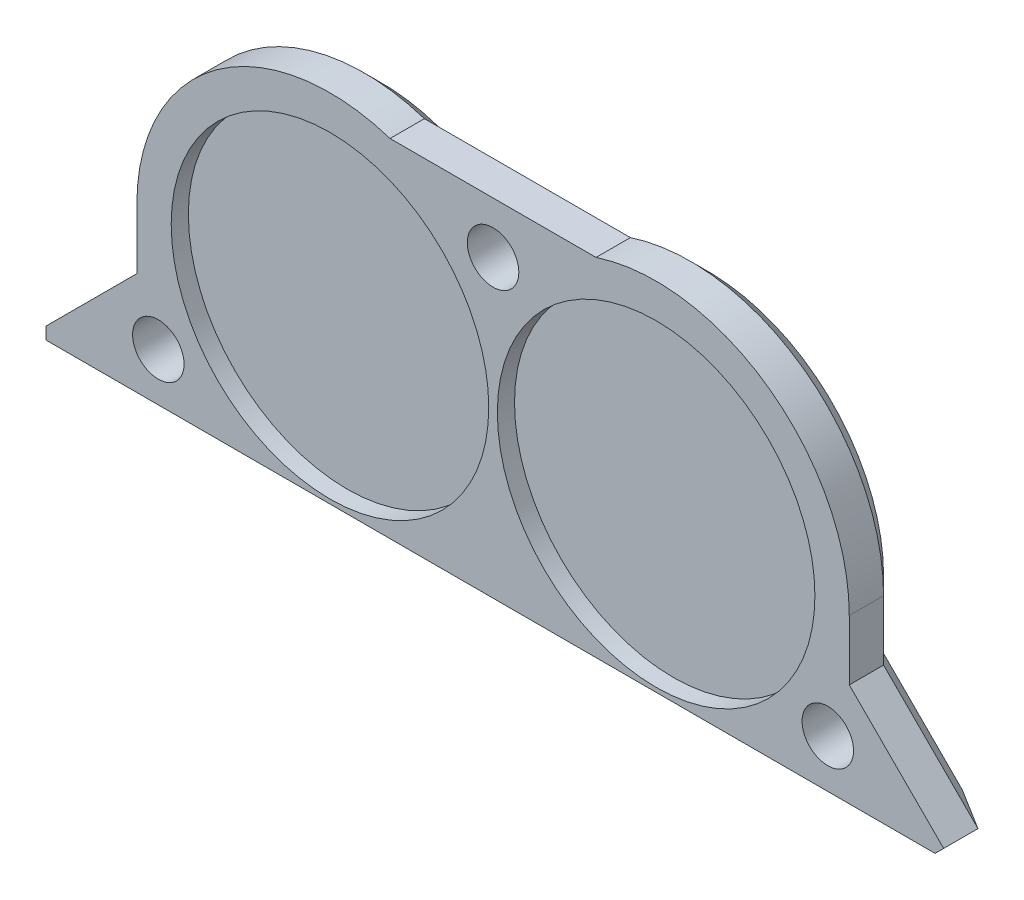
ISO-10303-21;
HEADER;
FILE_DESCRIPTION(('STEP AP214'),'2;1');
FILE_NAME('part.step','',(''),(''),'','','');
FILE_SCHEMA(('AUTOMOTIVE_DESIGN { 1 0 10303 214 1 1 1 1 }'));
ENDSEC;
DATA;
#1=APPLICATION_CONTEXT('core data for automotive mechanical design processes');
#2=APPLICATION_PROTOCOL_DEFINITION('international standard','automotive_design',2000,#1);
#3=PRODUCT_CONTEXT('',#1,'mechanical');
#4=PRODUCT('Part','Part','',(#3));
#5=PRODUCT_RELATED_PRODUCT_CATEGORY('part','',(#4));
#6=PRODUCT_DEFINITION_FORMATION('','',#4);
#7=PRODUCT_DEFINITION_CONTEXT('part definition',#1,'design');
#8=PRODUCT_DEFINITION('design','',#6,#7);
#9=PRODUCT_DEFINITION_SHAPE('','',#8);
#10=(LENGTH_UNIT() NAMED_UNIT(*) SI_UNIT(.MILLI.,.METRE.));
#11=(NAMED_UNIT(*) PLANE_ANGLE_UNIT() SI_UNIT($,.RADIAN.));
#12=(NAMED_UNIT(*) SI_UNIT($,.STERADIAN.) SOLID_ANGLE_UNIT());
#13=UNCERTAINTY_MEASURE_WITH_UNIT(LENGTH_MEASURE(1.E-05),#10,'distance_accuracy_value','');
#14=(GEOMETRIC_REPRESENTATION_CONTEXT(3) GLOBAL_UNCERTAINTY_ASSIGNED_CONTEXT((#13)) GLOBAL_UNIT_ASSIGNED_CONTEXT((#10,
#11,#12)) REPRESENTATION_CONTEXT('',''));
#15=CARTESIAN_POINT('',(0.,0.,0.));
#16=DIRECTION('',(0.,0.,1.));
#17=DIRECTION('',(1.,0.,0.));
#18=AXIS2_PLACEMENT_3D('',#15,#16,#17);
#19=CARTESIAN_POINT('',(0.,20.1917023901715,1.));
#20=DIRECTION('',(0.,1.,0.));
#21=DIRECTION('',(0.,0.,1.));
#22=AXIS2_PLACEMENT_3D('',#19,#20,#21);
#23=PLANE('',#22);
#24=DIRECTION('',(0.,0.,-1.));
#25=VECTOR('',#24,1.);
#26=CARTESIAN_POINT('',(6.,20.1917023901715,1.));
#27=LINE('',#26,#25);
#28=CARTESIAN_POINT('',(6.,20.1917023901715,1.));
#29=VERTEX_POINT('',#28);
#30=CARTESIAN_POINT('',(6.,20.1917023901715,-0.999999999999992));
#31=VERTEX_POINT('',#30);
#32=EDGE_CURVE('E210',#29,#31,#27,.T.);
#33=ORIENTED_EDGE('',*,*,#32,.T.);
#34=DIRECTION('',(-1.,0.,0.));
#35=VECTOR('',#34,1.);
#36=CARTESIAN_POINT('',(0.,20.1917023901715,-0.999999999999992));
#37=LINE('',#36,#35);
#38=CARTESIAN_POINT('',(-6.,20.1917023901715,-0.999999999999992));
#39=VERTEX_POINT('',#38);
#40=EDGE_CURVE('E162',#31,#39,#37,.T.);
#41=ORIENTED_EDGE('',*,*,#40,.T.);
#42=DIRECTION('',(0.,0.,-1.));
#43=VECTOR('',#42,1.);
#44=CARTESIAN_POINT('',(-6.,20.1917023901715,1.));
#45=LINE('',#44,#43);
#46=CARTESIAN_POINT('',(-6.,20.1917023901715,1.));
#47=VERTEX_POINT('',#46);
#48=EDGE_CURVE('E156',#47,#39,#45,.T.);
#49=ORIENTED_EDGE('',*,*,#48,.F.);
#50=DIRECTION('',(1.,0.,0.));
#51=VECTOR('',#50,1.);
#52=CARTESIAN_POINT('',(0.,20.1917023901715,1.));
#53=LINE('',#52,#51);
#54=EDGE_CURVE('E160',#47,#29,#53,.T.);
#55=ORIENTED_EDGE('',*,*,#54,.T.);
#56=EDGE_LOOP('',(#33,#41,#49,#55));
#57=FACE_BOUND('',#56,.T.);
#58=ADVANCED_FACE('F47',(#57),#23,.T.);
#59=CARTESIAN_POINT('',(-9.5,9.5,1.));
#60=DIRECTION('',(0.,0.,-1.));
#61=DIRECTION('',(-1.,0.,0.));
#62=AXIS2_PLACEMENT_3D('',#59,#60,#61);
#63=CYLINDRICAL_SURFACE('',#62,11.25);
#64=ORIENTED_EDGE('',*,*,#48,.T.);
#65=CARTESIAN_POINT('',(-9.5,9.5,-0.999999999999992));
#66=DIRECTION('',(0.,0.,-1.));
#67=DIRECTION('',(-1.,0.,0.));
#68=AXIS2_PLACEMENT_3D('',#65,#66,#67);
#69=CIRCLE('',#68,11.25);
#70=CARTESIAN_POINT('',(-20.75,9.5,-0.999999999999992));
#71=VERTEX_POINT('',#70);
#72=EDGE_CURVE('E279',#39,#71,#69,.F.);
#73=ORIENTED_EDGE('',*,*,#72,.T.);
#74=DIRECTION('',(0.,0.,-1.));
#75=VECTOR('',#74,1.);
#76=CARTESIAN_POINT('',(-20.75,9.5,1.));
#77=LINE('',#76,#75);
#78=CARTESIAN_POINT('',(-20.75,9.5,1.));
#79=VERTEX_POINT('',#78);
#80=EDGE_CURVE('E167',#79,#71,#77,.T.);
#81=ORIENTED_EDGE('',*,*,#80,.F.);
#82=CARTESIAN_POINT('',(-9.5,9.5,1.));
#83=DIRECTION('',(0.,0.,1.));
#84=DIRECTION('',(1.,0.,0.));
#85=AXIS2_PLACEMENT_3D('',#82,#83,#84);
#86=CIRCLE('',#85,11.25);
#87=EDGE_CURVE('E170',#47,#79,#86,.T.);
#88=ORIENTED_EDGE('',*,*,#87,.F.);
#89=EDGE_LOOP('',(#64,#73,#81,#88));
#90=FACE_BOUND('',#89,.T.);
#91=ADVANCED_FACE('F171',(#90),#63,.T.);
#92=CARTESIAN_POINT('',(-20.75,0.,1.));
#93=DIRECTION('',(-1.,0.,0.));
#94=DIRECTION('',(0.,0.,1.));
#95=AXIS2_PLACEMENT_3D('',#92,#93,#94);
#96=PLANE('',#95);
#97=ORIENTED_EDGE('',*,*,#80,.T.);
#98=DIRECTION('',(0.,-1.,0.));
#99=VECTOR('',#98,1.);
#100=CARTESIAN_POINT('',(-20.75,0.,-0.999999999999992));
#101=LINE('',#100,#99);
#102=CARTESIAN_POINT('',(-20.75,6.,-0.999999999999992));
#103=VERTEX_POINT('',#102);
#104=EDGE_CURVE('E276',#71,#103,#101,.T.);
#105=ORIENTED_EDGE('',*,*,#104,.T.);
#106=DIRECTION('',(0.,0.,-1.));
#107=VECTOR('',#106,1.);
#108=CARTESIAN_POINT('',(-20.75,6.,1.));
#109=LINE('',#108,#107);
#110=CARTESIAN_POINT('',(-20.75,6.,1.));
#111=VERTEX_POINT('',#110);
#112=EDGE_CURVE('E230',#111,#103,#109,.T.);
#113=ORIENTED_EDGE('',*,*,#112,.F.);
#114=DIRECTION('',(0.,1.,0.));
#115=VECTOR('',#114,1.);
#116=CARTESIAN_POINT('',(-20.75,0.,1.));
#117=LINE('',#116,#115);
#118=EDGE_CURVE('E176',#111,#79,#117,.T.);
#119=ORIENTED_EDGE('',*,*,#118,.T.);
#120=EDGE_LOOP('',(#97,#105,#113,#119));
#121=FACE_BOUND('',#120,.T.);
#122=ADVANCED_FACE('F368',(#121),#96,.T.);
#123=CARTESIAN_POINT('',(-13.375,13.375,1.));
#124=DIRECTION('',(-0.707106781186547,0.707106781186547,0.));
#125=DIRECTION('',(-0.707106781186548,-0.707106781186548,0.));
#126=AXIS2_PLACEMENT_3D('',#123,#124,#125);
#127=PLANE('',#126);
#128=ORIENTED_EDGE('',*,*,#112,.T.);
#129=DIRECTION('',(-0.707106781186548,-0.707106781186548,0.));
#130=VECTOR('',#129,1.);
#131=CARTESIAN_POINT('',(-13.375,13.375,-0.999999999999992));
#132=LINE('',#131,#130);
#133=CARTESIAN_POINT('',(-26.0428932188134,0.707106781186552,-0.999999999999992));
#134=VERTEX_POINT('',#133);
#135=EDGE_CURVE('E273',#103,#134,#132,.T.);
#136=ORIENTED_EDGE('',*,*,#135,.T.);
#137=DIRECTION('',(0.,0.,1.));
#138=VECTOR('',#137,1.);
#139=CARTESIAN_POINT('',(-26.0428932188134,0.707106781186552,1.));
#140=LINE('',#139,#138);
#141=CARTESIAN_POINT('',(-26.0428932188134,0.70710678118655,1.));
#142=VERTEX_POINT('',#141);
#143=EDGE_CURVE('E270',#134,#142,#140,.T.);
#144=ORIENTED_EDGE('',*,*,#143,.T.);
#145=DIRECTION('',(0.707106781186548,0.707106781186548,0.));
#146=VECTOR('',#145,1.);
#147=CARTESIAN_POINT('',(-13.375,13.375,1.));
#148=LINE('',#147,#146);
#149=EDGE_CURVE('E195',#142,#111,#148,.T.);
#150=ORIENTED_EDGE('',*,*,#149,.T.);
#151=EDGE_LOOP('',(#128,#136,#144,#150));
#152=FACE_BOUND('',#151,.T.);
#153=ADVANCED_FACE('F491',(#152),#127,.T.);
#154=CARTESIAN_POINT('',(0.,0.,1.));
#155=DIRECTION('',(0.,1.,0.));
#156=DIRECTION('',(-1.,0.,0.));
#157=AXIS2_PLACEMENT_3D('',#154,#155,#156);
#158=PLANE('',#157);
#159=DIRECTION('',(1.,0.,0.));
#160=VECTOR('',#159,1.);
#161=CARTESIAN_POINT('',(0.,0.,1.));
#162=LINE('',#161,#160);
#163=CARTESIAN_POINT('',(-26.0428932188134,0.,1.));
#164=VERTEX_POINT('',#163);
#165=CARTESIAN_POINT('',(25.75,0.,1.));
#166=VERTEX_POINT('',#165);
#167=EDGE_CURVE('E198',#164,#166,#162,.T.);
#168=ORIENTED_EDGE('',*,*,#167,.F.);
#169=DIRECTION('',(0.,0.,-1.));
#170=VECTOR('',#169,1.);
#171=CARTESIAN_POINT('',(-26.0428932188134,0.,-2.));
#172=LINE('',#171,#170);
#173=CARTESIAN_POINT('',(-26.0428932188134,0.,-0.999999999999992));
#174=VERTEX_POINT('',#173);
#175=EDGE_CURVE('E267',#164,#174,#172,.T.);
#176=ORIENTED_EDGE('',*,*,#175,.T.);
#177=DIRECTION('',(1.,0.,0.));
#178=VECTOR('',#177,1.);
#179=CARTESIAN_POINT('',(26.75,0.,-0.999999999999992));
#180=LINE('',#179,#178);
#181=CARTESIAN_POINT('',(25.75,0.,-0.999999999999992));
#182=VERTEX_POINT('',#181);
#183=EDGE_CURVE('E263',#174,#182,#180,.T.);
#184=ORIENTED_EDGE('',*,*,#183,.T.);
#185=DIRECTION('',(0.,0.,1.));
#186=VECTOR('',#185,1.);
#187=CARTESIAN_POINT('',(25.75,0.,1.));
#188=LINE('',#187,#186);
#189=EDGE_CURVE('E260',#182,#166,#188,.T.);
#190=ORIENTED_EDGE('',*,*,#189,.T.);
#191=EDGE_LOOP('',(#168,#176,#184,#190));
#192=FACE_BOUND('',#191,.T.);
#193=ADVANCED_FACE('F470',(#192),#158,.F.);
#194=CARTESIAN_POINT('',(13.375,13.375,1.));
#195=DIRECTION('',(-0.707106781186547,-0.707106781186548,0.));
#196=DIRECTION('',(0.707106781186548,-0.707106781186547,0.));
#197=AXIS2_PLACEMENT_3D('',#194,#195,#196);
#198=PLANE('',#197);
#199=DIRECTION('',(0.,0.,-1.));
#200=VECTOR('',#199,1.);
#201=CARTESIAN_POINT('',(26.25,0.500000000000002,1.));
#202=LINE('',#201,#200);
#203=CARTESIAN_POINT('',(26.25,0.499999999999999,1.));
#204=VERTEX_POINT('',#203);
#205=CARTESIAN_POINT('',(26.25,0.5,-0.999999999999993));
#206=VERTEX_POINT('',#205);
#207=EDGE_CURVE('E71',#204,#206,#202,.T.);
#208=ORIENTED_EDGE('',*,*,#207,.T.);
#209=DIRECTION('',(-0.707106781186548,0.707106781186547,0.));
#210=VECTOR('',#209,1.);
#211=CARTESIAN_POINT('',(20.75,6.,-0.999999999999993));
#212=LINE('',#211,#210);
#213=CARTESIAN_POINT('',(20.75,6.,-0.999999999999993));
#214=VERTEX_POINT('',#213);
#215=EDGE_CURVE('E292',#206,#214,#212,.T.);
#216=ORIENTED_EDGE('',*,*,#215,.T.);
#217=DIRECTION('',(0.,0.,-1.));
#218=VECTOR('',#217,1.);
#219=CARTESIAN_POINT('',(20.75,6.,1.));
#220=LINE('',#219,#218);
#221=CARTESIAN_POINT('',(20.75,6.,1.));
#222=VERTEX_POINT('',#221);
#223=EDGE_CURVE('E226',#222,#214,#220,.T.);
#224=ORIENTED_EDGE('',*,*,#223,.F.);
#225=DIRECTION('',(-0.707106781186548,0.707106781186547,0.));
#226=VECTOR('',#225,1.);
#227=CARTESIAN_POINT('',(13.375,13.375,1.));
#228=LINE('',#227,#226);
#229=EDGE_CURVE('E201',#204,#222,#228,.T.);
#230=ORIENTED_EDGE('',*,*,#229,.F.);
#231=EDGE_LOOP('',(#208,#216,#224,#230));
#232=FACE_BOUND('',#231,.T.);
#233=ADVANCED_FACE('F478',(#232),#198,.F.);
#234=CARTESIAN_POINT('',(20.75,0.,1.));
#235=DIRECTION('',(1.,0.,0.));
#236=DIRECTION('',(0.,0.,-1.));
#237=AXIS2_PLACEMENT_3D('',#234,#235,#236);
#238=PLANE('',#237);
#239=ORIENTED_EDGE('',*,*,#223,.T.);
#240=DIRECTION('',(0.,1.,0.));
#241=VECTOR('',#240,1.);
#242=CARTESIAN_POINT('',(20.75,0.,-0.999999999999992));
#243=LINE('',#242,#241);
#244=CARTESIAN_POINT('',(20.75,9.5,-0.999999999999992));
#245=VERTEX_POINT('',#244);
#246=EDGE_CURVE('E287',#214,#245,#243,.T.);
#247=ORIENTED_EDGE('',*,*,#246,.T.);
#248=DIRECTION('',(0.,0.,-1.));
#249=VECTOR('',#248,1.);
#250=CARTESIAN_POINT('',(20.75,9.5,1.));
#251=LINE('',#250,#249);
#252=CARTESIAN_POINT('',(20.75,9.5,1.));
#253=VERTEX_POINT('',#252);
#254=EDGE_CURVE('E222',#253,#245,#251,.T.);
#255=ORIENTED_EDGE('',*,*,#254,.F.);
#256=DIRECTION('',(0.,-1.,0.));
#257=VECTOR('',#256,1.);
#258=CARTESIAN_POINT('',(20.75,0.,1.));
#259=LINE('',#258,#257);
#260=EDGE_CURVE('E204',#253,#222,#259,.T.);
#261=ORIENTED_EDGE('',*,*,#260,.T.);
#262=EDGE_LOOP('',(#239,#247,#255,#261));
#263=FACE_BOUND('',#262,.T.);
#264=ADVANCED_FACE('F376',(#263),#238,.T.);
#265=CARTESIAN_POINT('',(9.5,9.5,1.));
#266=DIRECTION('',(0.,0.,-1.));
#267=DIRECTION('',(-1.,0.,0.));
#268=AXIS2_PLACEMENT_3D('',#265,#266,#267);
#269=CYLINDRICAL_SURFACE('',#268,9.25);
#270=CARTESIAN_POINT('',(9.5,9.5,1.));
#271=DIRECTION('',(0.,0.,1.));
#272=DIRECTION('',(1.,0.,0.));
#273=AXIS2_PLACEMENT_3D('',#270,#271,#272);
#274=CIRCLE('',#273,9.25);
#275=CARTESIAN_POINT('',(18.75,9.5,1.));
#276=VERTEX_POINT('',#275);
#277=EDGE_CURVE('E185',#276,#276,#274,.T.);
#278=ORIENTED_EDGE('',*,*,#277,.T.);
#279=EDGE_LOOP('',(#278));
#280=FACE_BOUND('',#279,.T.);
#281=CARTESIAN_POINT('',(9.5,9.5,0.));
#282=DIRECTION('',(0.,0.,1.));
#283=DIRECTION('',(1.,0.,0.));
#284=AXIS2_PLACEMENT_3D('',#281,#282,#283);
#285=CIRCLE('',#284,9.25);
#286=CARTESIAN_POINT('',(18.75,9.5,0.));
#287=VERTEX_POINT('',#286);
#288=EDGE_CURVE('E215',#287,#287,#285,.T.);
#289=ORIENTED_EDGE('',*,*,#288,.F.);
#290=EDGE_LOOP('',(#289));
#291=FACE_BOUND('',#290,.T.);
#292=ADVANCED_FACE('F372',(#280,#291),#269,.F.);
#293=CARTESIAN_POINT('',(-9.5,9.5,1.));
#294=DIRECTION('',(0.,0.,-1.));
#295=DIRECTION('',(-1.,0.,0.));
#296=AXIS2_PLACEMENT_3D('',#293,#294,#295);
#297=CYLINDRICAL_SURFACE('',#296,9.25);
#298=CARTESIAN_POINT('',(-9.5,9.5,1.));
#299=DIRECTION('',(0.,0.,1.));
#300=DIRECTION('',(1.,0.,0.));
#301=AXIS2_PLACEMENT_3D('',#298,#299,#300);
#302=CIRCLE('',#301,9.25);
#303=CARTESIAN_POINT('',(-0.249999999999997,9.5,1.));
#304=VERTEX_POINT('',#303);
#305=EDGE_CURVE('E189',#304,#304,#302,.T.);
#306=ORIENTED_EDGE('',*,*,#305,.T.);
#307=EDGE_LOOP('',(#306));
#308=FACE_BOUND('',#307,.T.);
#309=CARTESIAN_POINT('',(-9.5,9.5,0.));
#310=DIRECTION('',(0.,0.,1.));
#311=DIRECTION('',(1.,0.,0.));
#312=AXIS2_PLACEMENT_3D('',#309,#310,#311);
#313=CIRCLE('',#312,9.25);
#314=CARTESIAN_POINT('',(-0.249999999999997,9.5,0.));
#315=VERTEX_POINT('',#314);
#316=EDGE_CURVE('E211',#315,#315,#313,.T.);
#317=ORIENTED_EDGE('',*,*,#316,.F.);
#318=EDGE_LOOP('',(#317));
#319=FACE_BOUND('',#318,.T.);
#320=ADVANCED_FACE('F375',(#308,#319),#297,.F.);
#321=CARTESIAN_POINT('',(9.5,9.5,1.));
#322=DIRECTION('',(0.,0.,-1.));
#323=DIRECTION('',(-1.,0.,0.));
#324=AXIS2_PLACEMENT_3D('',#321,#322,#323);
#325=CYLINDRICAL_SURFACE('',#324,11.25);
#326=ORIENTED_EDGE('',*,*,#254,.T.);
#327=CARTESIAN_POINT('',(9.5,9.5,-0.999999999999992));
#328=DIRECTION('',(0.,0.,-1.));
#329=DIRECTION('',(-1.,0.,0.));
#330=AXIS2_PLACEMENT_3D('',#327,#328,#329);
#331=CIRCLE('',#330,11.25);
#332=EDGE_CURVE('E284',#245,#31,#331,.F.);
#333=ORIENTED_EDGE('',*,*,#332,.T.);
#334=ORIENTED_EDGE('',*,*,#32,.F.);
#335=CARTESIAN_POINT('',(9.5,9.5,1.));
#336=DIRECTION('',(0.,0.,1.));
#337=DIRECTION('',(1.,0.,0.));
#338=AXIS2_PLACEMENT_3D('',#335,#336,#337);
#339=CIRCLE('',#338,11.25);
#340=EDGE_CURVE('E182',#253,#29,#339,.T.);
#341=ORIENTED_EDGE('',*,*,#340,.F.);
#342=EDGE_LOOP('',(#326,#333,#334,#341));
#343=FACE_BOUND('',#342,.T.);
#344=ADVANCED_FACE('F380',(#343),#325,.T.);
#345=CARTESIAN_POINT('',(0.,0.,1.));
#346=DIRECTION('',(0.,0.,1.));
#347=DIRECTION('',(1.,0.,0.));
#348=AXIS2_PLACEMENT_3D('',#345,#346,#347);
#349=PLANE('',#348);
#350=CARTESIAN_POINT('',(-19.5,2.8,1.));
#351=DIRECTION('',(0.,0.,1.));
#352=DIRECTION('',(1.,0.,0.));
#353=AXIS2_PLACEMENT_3D('',#350,#351,#352);
#354=CIRCLE('',#353,1.5);
#355=CARTESIAN_POINT('',(-18.,2.8,1.));
#356=VERTEX_POINT('',#355);
#357=EDGE_CURVE('E794',#356,#356,#354,.T.);
#358=ORIENTED_EDGE('',*,*,#357,.F.);
#359=EDGE_LOOP('',(#358));
#360=FACE_BOUND('',#359,.T.);
#361=CARTESIAN_POINT('',(19.5,2.8,1.));
#362=DIRECTION('',(0.,0.,1.));
#363=DIRECTION('',(1.,0.,0.));
#364=AXIS2_PLACEMENT_3D('',#361,#362,#363);
#365=CIRCLE('',#364,1.5);
#366=CARTESIAN_POINT('',(21.,2.8,1.));
#367=VERTEX_POINT('',#366);
#368=EDGE_CURVE('E781',#367,#367,#365,.T.);
#369=ORIENTED_EDGE('',*,*,#368,.F.);
#370=EDGE_LOOP('',(#369));
#371=FACE_BOUND('',#370,.T.);
#372=CARTESIAN_POINT('',(0.,17.1917023901715,1.));
#373=DIRECTION('',(0.,0.,1.));
#374=DIRECTION('',(1.,0.,0.));
#375=AXIS2_PLACEMENT_3D('',#372,#373,#374);
#376=CIRCLE('',#375,1.5);
#377=CARTESIAN_POINT('',(1.5,17.1917023901715,1.));
#378=VERTEX_POINT('',#377);
#379=EDGE_CURVE('E773',#378,#378,#376,.T.);
#380=ORIENTED_EDGE('',*,*,#379,.F.);
#381=EDGE_LOOP('',(#380));
#382=FACE_BOUND('',#381,.T.);
#383=ORIENTED_EDGE('',*,*,#305,.F.);
#384=EDGE_LOOP('',(#383));
#385=FACE_BOUND('',#384,.T.);
#386=ORIENTED_EDGE('',*,*,#277,.F.);
#387=EDGE_LOOP('',(#386));
#388=FACE_BOUND('',#387,.T.);
#389=ORIENTED_EDGE('',*,*,#149,.F.);
#390=DIRECTION('',(0.,-1.,0.));
#391=VECTOR('',#390,1.);
#392=CARTESIAN_POINT('',(-26.0428932188134,-1.27780469516142E-13,1.));
#393=LINE('',#392,#391);
#394=EDGE_CURVE('E11',#142,#164,#393,.T.);
#395=ORIENTED_EDGE('',*,*,#394,.T.);
#396=ORIENTED_EDGE('',*,*,#167,.T.);
#397=DIRECTION('',(-0.707106781186546,-0.707106781186549,0.));
#398=VECTOR('',#397,1.);
#399=CARTESIAN_POINT('',(12.8750000000001,-12.875,1.));
#400=LINE('',#399,#398);
#401=EDGE_CURVE('E63',#166,#204,#400,.F.);
#402=ORIENTED_EDGE('',*,*,#401,.T.);
#403=ORIENTED_EDGE('',*,*,#229,.T.);
#404=ORIENTED_EDGE('',*,*,#260,.F.);
#405=ORIENTED_EDGE('',*,*,#340,.T.);
#406=ORIENTED_EDGE('',*,*,#54,.F.);
#407=ORIENTED_EDGE('',*,*,#87,.T.);
#408=ORIENTED_EDGE('',*,*,#118,.F.);
#409=EDGE_LOOP('',(#389,#395,#396,#402,#403,#404,#405,#406,#407,#408));
#410=FACE_BOUND('',#409,.T.);
#411=ADVANCED_FACE('F179',(#360,#371,#382,#385,#388,#410),#349,.T.);
#412=CARTESIAN_POINT('',(-9.5,9.5,0.));
#413=DIRECTION('',(0.,0.,-1.));
#414=DIRECTION('',(-1.,0.,0.));
#415=AXIS2_PLACEMENT_3D('',#412,#413,#414);
#416=PLANE('',#415);
#417=ORIENTED_EDGE('',*,*,#288,.T.);
#418=EDGE_LOOP('',(#417));
#419=FACE_BOUND('',#418,.T.);
#420=ADVANCED_FACE('F534',(#419),#416,.F.);
#421=ORIENTED_EDGE('',*,*,#316,.T.);
#422=EDGE_LOOP('',(#421));
#423=FACE_BOUND('',#422,.T.);
#424=ADVANCED_FACE('F547',(#423),#416,.F.);
#425=CARTESIAN_POINT('',(-9.5,9.5,-2.));
#426=DIRECTION('',(0.,0.,-1.));
#427=DIRECTION('',(-1.,0.,0.));
#428=AXIS2_PLACEMENT_3D('',#425,#426,#427);
#429=PLANE('',#428);
#430=DIRECTION('',(0.707106781186548,-0.707106781186547,0.));
#431=VECTOR('',#430,1.);
#432=CARTESIAN_POINT('',(26.0428932188134,-0.70710678118654,-2.));
#433=LINE('',#432,#431);
#434=CARTESIAN_POINT('',(19.75,5.5857864376269,-2.));
#435=VERTEX_POINT('',#434);
#436=CARTESIAN_POINT('',(24.3357864376269,1.,-2.));
#437=VERTEX_POINT('',#436);
#438=EDGE_CURVE('E166',#435,#437,#433,.T.);
#439=ORIENTED_EDGE('',*,*,#438,.T.);
#440=DIRECTION('',(-1.,0.,0.));
#441=VECTOR('',#440,1.);
#442=CARTESIAN_POINT('',(-26.75,0.999999999999996,-2.));
#443=LINE('',#442,#441);
#444=CARTESIAN_POINT('',(-24.3357864376269,0.999999999999996,-2.));
#445=VERTEX_POINT('',#444);
#446=EDGE_CURVE('E256',#437,#445,#443,.T.);
#447=ORIENTED_EDGE('',*,*,#446,.T.);
#448=DIRECTION('',(0.707106781186548,0.707106781186548,0.));
#449=VECTOR('',#448,1.);
#450=CARTESIAN_POINT('',(-12.6678932188135,12.6678932188135,-2.));
#451=LINE('',#450,#449);
#452=CARTESIAN_POINT('',(-19.75,5.5857864376269,-2.));
#453=VERTEX_POINT('',#452);
#454=EDGE_CURVE('E253',#445,#453,#451,.T.);
#455=ORIENTED_EDGE('',*,*,#454,.T.);
#456=DIRECTION('',(0.,1.,0.));
#457=VECTOR('',#456,1.);
#458=CARTESIAN_POINT('',(-19.75,9.5,-2.));
#459=LINE('',#458,#457);
#460=CARTESIAN_POINT('',(-19.75,9.5,-2.));
#461=VERTEX_POINT('',#460);
#462=EDGE_CURVE('E250',#453,#461,#459,.T.);
#463=ORIENTED_EDGE('',*,*,#462,.T.);
#464=CARTESIAN_POINT('',(-9.5,9.5,-2.));
#465=DIRECTION('',(0.,0.,-1.));
#466=DIRECTION('',(-1.,0.,0.));
#467=AXIS2_PLACEMENT_3D('',#464,#465,#466);
#468=CIRCLE('',#467,10.25);
#469=CARTESIAN_POINT('',(-6.16332429200168,19.1917023901715,-2.));
#470=VERTEX_POINT('',#469);
#471=EDGE_CURVE('E247',#461,#470,#468,.T.);
#472=ORIENTED_EDGE('',*,*,#471,.T.);
#473=DIRECTION('',(1.,0.,0.));
#474=VECTOR('',#473,1.);
#475=CARTESIAN_POINT('',(-9.5,19.1917023901715,-2.));
#476=LINE('',#475,#474);
#477=CARTESIAN_POINT('',(6.16332429200169,19.1917023901714,-2.));
#478=VERTEX_POINT('',#477);
#479=EDGE_CURVE('E244',#470,#478,#476,.T.);
#480=ORIENTED_EDGE('',*,*,#479,.T.);
#481=CARTESIAN_POINT('',(9.5,9.5,-2.));
#482=DIRECTION('',(0.,0.,-1.));
#483=DIRECTION('',(-1.,0.,0.));
#484=AXIS2_PLACEMENT_3D('',#481,#482,#483);
#485=CIRCLE('',#484,10.25);
#486=CARTESIAN_POINT('',(19.75,9.5,-2.));
#487=VERTEX_POINT('',#486);
#488=EDGE_CURVE('E241',#478,#487,#485,.T.);
#489=ORIENTED_EDGE('',*,*,#488,.T.);
#490=DIRECTION('',(0.,-1.,0.));
#491=VECTOR('',#490,1.);
#492=CARTESIAN_POINT('',(19.75,9.5,-2.));
#493=LINE('',#492,#491);
#494=EDGE_CURVE('E238',#487,#435,#493,.T.);
#495=ORIENTED_EDGE('',*,*,#494,.T.);
#496=EDGE_LOOP('',(#439,#447,#455,#463,#472,#480,#489,#495));
#497=FACE_BOUND('',#496,.T.);
#498=CARTESIAN_POINT('',(-19.5,2.8,-2.));
#499=DIRECTION('',(0.,0.,1.));
#500=DIRECTION('',(1.,0.,0.));
#501=AXIS2_PLACEMENT_3D('',#498,#499,#500);
#502=CIRCLE('',#501,1.5);
#503=CARTESIAN_POINT('',(-18.,2.8,-2.));
#504=VERTEX_POINT('',#503);
#505=EDGE_CURVE('E216',#504,#504,#502,.T.);
#506=ORIENTED_EDGE('',*,*,#505,.T.);
#507=EDGE_LOOP('',(#506));
#508=FACE_BOUND('',#507,.T.);
#509=CARTESIAN_POINT('',(19.5,2.8,-2.));
#510=DIRECTION('',(0.,0.,1.));
#511=DIRECTION('',(1.,0.,0.));
#512=AXIS2_PLACEMENT_3D('',#509,#510,#511);
#513=CIRCLE('',#512,1.5);
#514=CARTESIAN_POINT('',(21.,2.8,-2.));
#515=VERTEX_POINT('',#514);
#516=EDGE_CURVE('E776',#515,#515,#513,.T.);
#517=ORIENTED_EDGE('',*,*,#516,.T.);
#518=EDGE_LOOP('',(#517));
#519=FACE_BOUND('',#518,.T.);
#520=CARTESIAN_POINT('',(0.,17.1917023901715,-2.));
#521=DIRECTION('',(0.,0.,1.));
#522=DIRECTION('',(1.,0.,0.));
#523=AXIS2_PLACEMENT_3D('',#520,#521,#522);
#524=CIRCLE('',#523,1.5);
#525=CARTESIAN_POINT('',(1.5,17.1917023901715,-2.));
#526=VERTEX_POINT('',#525);
#527=EDGE_CURVE('E770',#526,#526,#524,.T.);
#528=ORIENTED_EDGE('',*,*,#527,.T.);
#529=EDGE_LOOP('',(#528));
#530=FACE_BOUND('',#529,.T.);
#531=ADVANCED_FACE('F542',(#497,#508,#519,#530),#429,.T.);
#532=CARTESIAN_POINT('',(0.,17.1917023901715,-2.));
#533=DIRECTION('',(0.,0.,1.));
#534=DIRECTION('',(1.,0.,0.));
#535=AXIS2_PLACEMENT_3D('',#532,#533,#534);
#536=CYLINDRICAL_SURFACE('',#535,1.5);
#537=ORIENTED_EDGE('',*,*,#527,.F.);
#538=EDGE_LOOP('',(#537));
#539=FACE_BOUND('',#538,.T.);
#540=ORIENTED_EDGE('',*,*,#379,.T.);
#541=EDGE_LOOP('',(#540));
#542=FACE_BOUND('',#541,.T.);
#543=ADVANCED_FACE('F546',(#539,#542),#536,.F.);
#544=CARTESIAN_POINT('',(19.5,2.8,-2.));
#545=DIRECTION('',(0.,0.,1.));
#546=DIRECTION('',(1.,0.,0.));
#547=AXIS2_PLACEMENT_3D('',#544,#545,#546);
#548=CYLINDRICAL_SURFACE('',#547,1.5);
#549=ORIENTED_EDGE('',*,*,#516,.F.);
#550=EDGE_LOOP('',(#549));
#551=FACE_BOUND('',#550,.T.);
#552=ORIENTED_EDGE('',*,*,#368,.T.);
#553=EDGE_LOOP('',(#552));
#554=FACE_BOUND('',#553,.T.);
#555=ADVANCED_FACE('F360',(#551,#554),#548,.F.);
#556=CARTESIAN_POINT('',(-19.5,2.8,-2.));
#557=DIRECTION('',(0.,0.,1.));
#558=DIRECTION('',(1.,0.,0.));
#559=AXIS2_PLACEMENT_3D('',#556,#557,#558);
#560=CYLINDRICAL_SURFACE('',#559,1.5);
#561=ORIENTED_EDGE('',*,*,#505,.F.);
#562=EDGE_LOOP('',(#561));
#563=FACE_BOUND('',#562,.T.);
#564=ORIENTED_EDGE('',*,*,#357,.T.);
#565=EDGE_LOOP('',(#564));
#566=FACE_BOUND('',#565,.T.);
#567=ADVANCED_FACE('F352',(#563,#566),#560,.F.);
#568=CARTESIAN_POINT('',(-9.5,19.1917023901715,-2.));
#569=DIRECTION('',(0.,-0.707106781186551,0.707106781186544));
#570=DIRECTION('',(1.,0.,0.));
#571=AXIS2_PLACEMENT_3D('',#568,#569,#570);
#572=PLANE('',#571);
#573=CARTESIAN_POINT('',(-6.16332429200168,19.1917023901714,-2.));
#574=CARTESIAN_POINT('',(-6.13546193500631,19.3583166735596,-1.8333857166119));
#575=CARTESIAN_POINT('',(-6.10792039769635,19.5249571557717,-1.66674523439983));
#576=CARTESIAN_POINT('',(-6.05347896713953,19.8582904891141,-1.33341190105747));
#577=CARTESIAN_POINT('',(-6.02657907378207,20.0249833402353,-1.16671904993623));
#578=CARTESIAN_POINT('',(-5.99999999999942,20.1917023901715,-1.00000000000004));
#579=B_SPLINE_CURVE_WITH_KNOTS('',3,(#573,#574,#575,#576,#577,#578),.UNSPECIFIED.,.F.,.F.,(4,2,
4),(0.,0.71180737008718,1.42361461747408),.UNSPECIFIED.);
#580=EDGE_CURVE('E334',#39,#470,#579,.F.);
#581=ORIENTED_EDGE('',*,*,#580,.F.);
#582=ORIENTED_EDGE('',*,*,#40,.F.);
#583=CARTESIAN_POINT('',(6.16332429200163,19.1917023901715,-2.));
#584=CARTESIAN_POINT('',(6.13546193500628,19.3583166735597,-1.83338571661187));
#585=CARTESIAN_POINT('',(6.10792039769634,19.5249571557718,-1.66674523439979));
#586=CARTESIAN_POINT('',(6.05347896713954,19.8582904891141,-1.33341190105743));
#587=CARTESIAN_POINT('',(6.02657907378208,20.0249833402353,-1.1667190499362));
#588=CARTESIAN_POINT('',(5.99999999999943,20.1917023901715,-1.00000000000004));
#589=B_SPLINE_CURVE_WITH_KNOTS('',3,(#583,#584,#585,#586,#587,#588),.UNSPECIFIED.,.F.,.F.,(4,2,
4),(0.,0.711807370087123,1.42361461747396),.UNSPECIFIED.);
#590=EDGE_CURVE('E53',#478,#31,#589,.T.);
#591=ORIENTED_EDGE('',*,*,#590,.F.);
#592=ORIENTED_EDGE('',*,*,#479,.F.);
#593=EDGE_LOOP('',(#581,#582,#591,#592));
#594=FACE_BOUND('',#593,.T.);
#595=ADVANCED_FACE('F347',(#594),#572,.F.);
#596=CARTESIAN_POINT('',(9.5,9.5,-2.));
#597=DIRECTION('',(0.,0.,1.));
#598=DIRECTION('',(1.,0.,0.));
#599=AXIS2_PLACEMENT_3D('',#596,#597,#598);
#600=CONICAL_SURFACE('',#599,10.25,0.785398163397443);
#601=ORIENTED_EDGE('',*,*,#590,.T.);
#602=ORIENTED_EDGE('',*,*,#332,.F.);
#603=DIRECTION('',(0.707106781186544,0.,0.707106781186551));
#604=VECTOR('',#603,1.);
#605=CARTESIAN_POINT('',(19.75,9.5,-2.));
#606=LINE('',#605,#604);
#607=EDGE_CURVE('E331',#487,#245,#606,.T.);
#608=ORIENTED_EDGE('',*,*,#607,.F.);
#609=ORIENTED_EDGE('',*,*,#488,.F.);
#610=EDGE_LOOP('',(#601,#602,#608,#609));
#611=FACE_BOUND('',#610,.T.);
#612=ADVANCED_FACE('F50',(#611),#600,.T.);
#613=CARTESIAN_POINT('',(-9.5,9.5,-2.));
#614=DIRECTION('',(0.,0.,1.));
#615=DIRECTION('',(1.,0.,0.));
#616=AXIS2_PLACEMENT_3D('',#613,#614,#615);
#617=CONICAL_SURFACE('',#616,10.25,0.785398163397443);
#618=ORIENTED_EDGE('',*,*,#580,.T.);
#619=ORIENTED_EDGE('',*,*,#471,.F.);
#620=DIRECTION('',(0.707106781186544,0.,-0.707106781186551));
#621=VECTOR('',#620,1.);
#622=CARTESIAN_POINT('',(-20.75,9.5,-0.999999999999992));
#623=LINE('',#622,#621);
#624=EDGE_CURVE('E327',#71,#461,#623,.T.);
#625=ORIENTED_EDGE('',*,*,#624,.F.);
#626=ORIENTED_EDGE('',*,*,#72,.F.);
#627=EDGE_LOOP('',(#618,#619,#625,#626));
#628=FACE_BOUND('',#627,.T.);
#629=ADVANCED_FACE('F343',(#628),#617,.T.);
#630=CARTESIAN_POINT('',(19.75,9.5,-2.));
#631=DIRECTION('',(-0.707106781186551,0.,0.707106781186544));
#632=DIRECTION('',(0.,-1.,0.));
#633=AXIS2_PLACEMENT_3D('',#630,#631,#632);
#634=PLANE('',#633);
#635=ORIENTED_EDGE('',*,*,#607,.T.);
#636=ORIENTED_EDGE('',*,*,#246,.F.);
#637=DIRECTION('',(-0.678598344545843,-0.281084637714822,-0.67859834454585));
#638=VECTOR('',#637,1.);
#639=CARTESIAN_POINT('',(20.4966110679662,5.89504286779636,-1.25338893203381));
#640=LINE('',#639,#638);
#641=EDGE_CURVE('E323',#435,#214,#640,.F.);
#642=ORIENTED_EDGE('',*,*,#641,.F.);
#643=ORIENTED_EDGE('',*,*,#494,.F.);
#644=EDGE_LOOP('',(#635,#636,#642,#643));
#645=FACE_BOUND('',#644,.T.);
#646=ADVANCED_FACE('F435',(#645),#634,.F.);
#647=CARTESIAN_POINT('',(-19.75,9.5,-2.));
#648=DIRECTION('',(0.707106781186551,0.,0.707106781186544));
#649=DIRECTION('',(0.,1.,0.));
#650=AXIS2_PLACEMENT_3D('',#647,#648,#649);
#651=PLANE('',#650);
#652=ORIENTED_EDGE('',*,*,#624,.T.);
#653=ORIENTED_EDGE('',*,*,#462,.F.);
#654=DIRECTION('',(-0.678598344545844,0.281084637714819,0.678598344545851));
#655=VECTOR('',#654,1.);
#656=CARTESIAN_POINT('',(-17.8395865160594,4.79446726283826,-3.91041348394064));
#657=LINE('',#656,#655);
#658=EDGE_CURVE('E319',#103,#453,#657,.F.);
#659=ORIENTED_EDGE('',*,*,#658,.F.);
#660=ORIENTED_EDGE('',*,*,#104,.F.);
#661=EDGE_LOOP('',(#652,#653,#659,#660));
#662=FACE_BOUND('',#661,.T.);
#663=ADVANCED_FACE('F429',(#662),#651,.F.);
#664=CARTESIAN_POINT('',(26.25,0.500000000000002,1.));
#665=DIRECTION('',(-0.707106781186549,0.707106781186546,0.));
#666=DIRECTION('',(0.,0.,-1.));
#667=AXIS2_PLACEMENT_3D('',#664,#665,#666);
#668=PLANE('',#667);
#669=ORIENTED_EDGE('',*,*,#401,.F.);
#670=ORIENTED_EDGE('',*,*,#189,.F.);
#671=DIRECTION('',(0.707106781186546,0.707106781186549,0.));
#672=VECTOR('',#671,1.);
#673=CARTESIAN_POINT('',(25.75,0.,-0.999999999999992));
#674=LINE('',#673,#672);
#675=EDGE_CURVE('E315',#206,#182,#674,.F.);
#676=ORIENTED_EDGE('',*,*,#675,.F.);
#677=ORIENTED_EDGE('',*,*,#207,.F.);
#678=EDGE_LOOP('',(#669,#670,#676,#677));
#679=FACE_BOUND('',#678,.T.);
#680=ADVANCED_FACE('F422',(#679),#668,.F.);
#681=CARTESIAN_POINT('',(3.16789321881343,22.1678932188134,-2.));
#682=DIRECTION('',(0.500000000000001,0.500000000000002,-0.707106781186545));
#683=DIRECTION('',(-0.707106781186548,0.707106781186547,0.));
#684=AXIS2_PLACEMENT_3D('',#681,#682,#683);
#685=PLANE('',#684);
#686=ORIENTED_EDGE('',*,*,#641,.T.);
#687=ORIENTED_EDGE('',*,*,#215,.F.);
#688=DIRECTION('',(0.863502055752851,-0.225550083001803,0.451100166003605));
#689=VECTOR('',#688,1.);
#690=CARTESIAN_POINT('',(25.974563580029,0.571945060202584,-1.14389012040515));
#691=LINE('',#690,#689);
#692=EDGE_CURVE('E311',#437,#206,#691,.T.);
#693=ORIENTED_EDGE('',*,*,#692,.F.);
#694=ORIENTED_EDGE('',*,*,#438,.F.);
#695=EDGE_LOOP('',(#686,#687,#693,#694));
#696=FACE_BOUND('',#695,.T.);
#697=ADVANCED_FACE('F415',(#696),#685,.T.);
#698=CARTESIAN_POINT('',(-12.6678932188135,12.6678932188135,-2.));
#699=DIRECTION('',(0.500000000000003,-0.500000000000003,0.707106781186544));
#700=DIRECTION('',(0.707106781186548,0.707106781186548,0.));
#701=AXIS2_PLACEMENT_3D('',#698,#699,#700);
#702=PLANE('',#701);
#703=ORIENTED_EDGE('',*,*,#658,.T.);
#704=ORIENTED_EDGE('',*,*,#454,.F.);
#705=DIRECTION('',(-0.853553390593271,-0.146446609406722,0.500000000000006));
#706=VECTOR('',#705,1.);
#707=CARTESIAN_POINT('',(-24.3357864376269,0.999999999999996,-2.));
#708=LINE('',#707,#706);
#709=EDGE_CURVE('E307',#134,#445,#708,.F.);
#710=ORIENTED_EDGE('',*,*,#709,.F.);
#711=ORIENTED_EDGE('',*,*,#135,.F.);
#712=EDGE_LOOP('',(#703,#704,#710,#711));
#713=FACE_BOUND('',#712,.T.);
#714=ADVANCED_FACE('F408',(#713),#702,.F.);
#715=CARTESIAN_POINT('',(-26.0428932188134,0.,1.));
#716=DIRECTION('',(-1.,0.,0.));
#717=DIRECTION('',(0.,0.,1.));
#718=AXIS2_PLACEMENT_3D('',#715,#716,#717);
#719=PLANE('',#718);
#720=ORIENTED_EDGE('',*,*,#394,.F.);
#721=ORIENTED_EDGE('',*,*,#143,.F.);
#722=DIRECTION('',(0.,1.,0.));
#723=VECTOR('',#722,1.);
#724=CARTESIAN_POINT('',(-26.0428932188134,0.999999999999988,-0.999999999999992));
#725=LINE('',#724,#723);
#726=EDGE_CURVE('E303',#174,#134,#725,.T.);
#727=ORIENTED_EDGE('',*,*,#726,.F.);
#728=ORIENTED_EDGE('',*,*,#175,.F.);
#729=EDGE_LOOP('',(#720,#721,#727,#728));
#730=FACE_BOUND('',#729,.T.);
#731=ADVANCED_FACE('F401',(#730),#719,.T.);
#732=CARTESIAN_POINT('',(25.75,0.,-0.999999999999992));
#733=DIRECTION('',(0.357406744336594,-0.357406744336595,-0.862856209461016));
#734=DIRECTION('',(0.,0.923879532511286,-0.382683432365091));
#735=AXIS2_PLACEMENT_3D('',#732,#733,#734);
#736=PLANE('',#735);
#737=ORIENTED_EDGE('',*,*,#692,.T.);
#738=ORIENTED_EDGE('',*,*,#675,.T.);
#739=DIRECTION('',(-0.707106781186551,0.499999999999995,-0.500000000000001));
#740=VECTOR('',#739,1.);
#741=CARTESIAN_POINT('',(25.75,0.,-0.999999999999992));
#742=LINE('',#741,#740);
#743=EDGE_CURVE('E300',#437,#182,#742,.F.);
#744=ORIENTED_EDGE('',*,*,#743,.F.);
#745=EDGE_LOOP('',(#737,#738,#744));
#746=FACE_BOUND('',#745,.T.);
#747=ADVANCED_FACE('F395',(#746),#736,.T.);
#748=CARTESIAN_POINT('',(-24.3357864376269,0.999999999999996,-2.));
#749=DIRECTION('',(-0.505449465124429,0.,-0.862856209461014));
#750=DIRECTION('',(-0.862856209461014,0.,0.505449465124429));
#751=AXIS2_PLACEMENT_3D('',#748,#749,#750);
#752=PLANE('',#751);
#753=ORIENTED_EDGE('',*,*,#726,.T.);
#754=ORIENTED_EDGE('',*,*,#709,.T.);
#755=DIRECTION('',(-0.770076152379125,-0.451100166003604,0.451100166003609));
#756=VECTOR('',#755,1.);
#757=CARTESIAN_POINT('',(-24.3357864376269,0.999999999999996,-2.));
#758=LINE('',#757,#756);
#759=EDGE_CURVE('E297',#174,#445,#758,.F.);
#760=ORIENTED_EDGE('',*,*,#759,.F.);
#761=EDGE_LOOP('',(#753,#754,#760));
#762=FACE_BOUND('',#761,.T.);
#763=ADVANCED_FACE('F389',(#762),#752,.T.);
#764=CARTESIAN_POINT('',(-9.5,0.999999999999999,-2.));
#765=DIRECTION('',(0.,-0.707106781186552,-0.707106781186543));
#766=DIRECTION('',(1.,0.,0.));
#767=AXIS2_PLACEMENT_3D('',#764,#765,#766);
#768=PLANE('',#767);
#769=ORIENTED_EDGE('',*,*,#743,.T.);
#770=ORIENTED_EDGE('',*,*,#183,.F.);
#771=ORIENTED_EDGE('',*,*,#759,.T.);
#772=ORIENTED_EDGE('',*,*,#446,.F.);
#773=EDGE_LOOP('',(#769,#770,#771,#772));
#774=FACE_BOUND('',#773,.T.);
#775=ADVANCED_FACE('F383',(#774),#768,.T.);
#776=CLOSED_SHELL('',(#58,#91,#122,#153,#193,#233,#264,#292,#320,#344,#411,#420,#424,#531,#543,
#555,#567,#595,#612,#629,#646,#663,#680,#697,#714,#731,#747,#763,#775));
#777=MANIFOLD_SOLID_BREP('B2',#776);
#778=ADVANCED_BREP_SHAPE_REPRESENTATION('',(#18,#777),#14);
#779=SHAPE_DEFINITION_REPRESENTATION(#9,#778);
ENDSEC;
END-ISO-10303-21;
